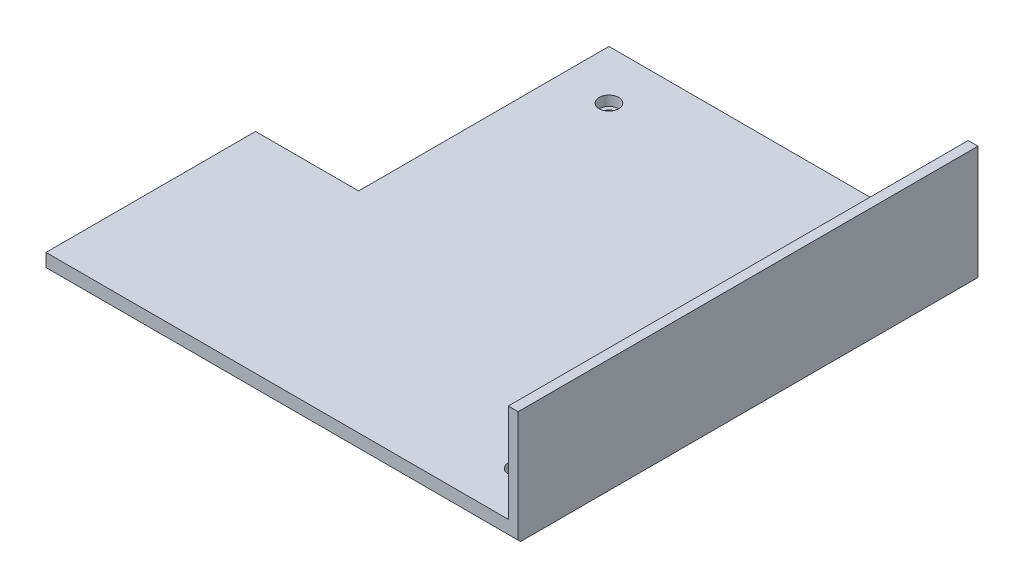
ISO-10303-21;
HEADER;
FILE_DESCRIPTION(('STEP AP214'),'2;1');
FILE_NAME('part.step','',(''),(''),'','','');
FILE_SCHEMA(('AUTOMOTIVE_DESIGN { 1 0 10303 214 1 1 1 1 }'));
ENDSEC;
DATA;
#1=APPLICATION_CONTEXT('core data for automotive mechanical design processes');
#2=APPLICATION_PROTOCOL_DEFINITION('international standard','automotive_design',2000,#1);
#3=PRODUCT_CONTEXT('',#1,'mechanical');
#4=PRODUCT('Part','Part','',(#3));
#5=PRODUCT_RELATED_PRODUCT_CATEGORY('part','',(#4));
#6=PRODUCT_DEFINITION_FORMATION('','',#4);
#7=PRODUCT_DEFINITION_CONTEXT('part definition',#1,'design');
#8=PRODUCT_DEFINITION('design','',#6,#7);
#9=PRODUCT_DEFINITION_SHAPE('','',#8);
#10=(LENGTH_UNIT() NAMED_UNIT(*) SI_UNIT(.MILLI.,.METRE.));
#11=(NAMED_UNIT(*) PLANE_ANGLE_UNIT() SI_UNIT($,.RADIAN.));
#12=(NAMED_UNIT(*) SI_UNIT($,.STERADIAN.) SOLID_ANGLE_UNIT());
#13=UNCERTAINTY_MEASURE_WITH_UNIT(LENGTH_MEASURE(1.E-05),#10,'distance_accuracy_value','');
#14=(GEOMETRIC_REPRESENTATION_CONTEXT(3) GLOBAL_UNCERTAINTY_ASSIGNED_CONTEXT((#13)) GLOBAL_UNIT_ASSIGNED_CONTEXT((#10,
#11,#12)) REPRESENTATION_CONTEXT('',''));
#15=CARTESIAN_POINT('',(0.,0.,0.));
#16=DIRECTION('',(0.,0.,1.));
#17=DIRECTION('',(1.,0.,0.));
#18=AXIS2_PLACEMENT_3D('',#15,#16,#17);
#19=CARTESIAN_POINT('',(96.2,6.35,-93.7));
#20=DIRECTION('',(1.,0.,0.));
#21=DIRECTION('',(0.,0.,1.));
#22=AXIS2_PLACEMENT_3D('',#19,#20,#21);
#23=PLANE('',#22);
#24=DIRECTION('',(0.,1.,0.));
#25=VECTOR('',#24,1.);
#26=CARTESIAN_POINT('',(96.2,-0.00100000000000013,8.3));
#27=LINE('',#26,#25);
#28=CARTESIAN_POINT('',(96.2,1.,8.3));
#29=VERTEX_POINT('',#28);
#30=CARTESIAN_POINT('',(96.2,6.35,8.3));
#31=VERTEX_POINT('',#30);
#32=EDGE_CURVE('E223',#29,#31,#27,.T.);
#33=ORIENTED_EDGE('',*,*,#32,.F.);
#34=DIRECTION('',(0.,0.,1.));
#35=VECTOR('',#34,1.);
#36=CARTESIAN_POINT('',(96.2,1.,-93.7));
#37=LINE('',#36,#35);
#38=CARTESIAN_POINT('',(96.2,1.,93.7));
#39=VERTEX_POINT('',#38);
#40=EDGE_CURVE('E11',#29,#39,#37,.T.);
#41=ORIENTED_EDGE('',*,*,#40,.T.);
#42=DIRECTION('',(0.,-1.,0.));
#43=VECTOR('',#42,1.);
#44=CARTESIAN_POINT('',(96.2,6.35,93.7));
#45=LINE('',#44,#43);
#46=CARTESIAN_POINT('',(96.2,6.35,93.7));
#47=VERTEX_POINT('',#46);
#48=EDGE_CURVE('E159',#47,#39,#45,.T.);
#49=ORIENTED_EDGE('',*,*,#48,.F.);
#50=DIRECTION('',(0.,0.,-1.));
#51=VECTOR('',#50,1.);
#52=CARTESIAN_POINT('',(96.2,6.35,-93.7));
#53=LINE('',#52,#51);
#54=EDGE_CURVE('E155',#47,#31,#53,.T.);
#55=ORIENTED_EDGE('',*,*,#54,.T.);
#56=EDGE_LOOP('',(#33,#41,#49,#55));
#57=FACE_BOUND('',#56,.T.);
#58=ADVANCED_FACE('F47',(#57),#23,.F.);
#59=CARTESIAN_POINT('',(288.6,6.35,-93.7000000000001));
#60=DIRECTION('',(0.,0.,1.));
#61=DIRECTION('',(-1.,0.,0.));
#62=AXIS2_PLACEMENT_3D('',#59,#60,#61);
#63=PLANE('',#62);
#64=DIRECTION('',(1.,0.,0.));
#65=VECTOR('',#64,1.);
#66=CARTESIAN_POINT('',(288.6,6.35,-93.7000000000001));
#67=LINE('',#66,#65);
#68=CARTESIAN_POINT('',(138.2,6.35,-93.7));
#69=VERTEX_POINT('',#68);
#70=CARTESIAN_POINT('',(284.6,6.35,-93.7000000000001));
#71=VERTEX_POINT('',#70);
#72=EDGE_CURVE('E143',#69,#71,#67,.T.);
#73=ORIENTED_EDGE('',*,*,#72,.T.);
#74=DIRECTION('',(0.,-1.,0.));
#75=VECTOR('',#74,1.);
#76=CARTESIAN_POINT('',(284.6,46.35,-93.7000000000001));
#77=LINE('',#76,#75);
#78=CARTESIAN_POINT('',(284.6,46.35,-93.7000000000001));
#79=VERTEX_POINT('',#78);
#80=EDGE_CURVE('E242',#79,#71,#77,.T.);
#81=ORIENTED_EDGE('',*,*,#80,.F.);
#82=DIRECTION('',(1.,0.,0.));
#83=VECTOR('',#82,1.);
#84=CARTESIAN_POINT('',(284.6,46.35,-93.7000000000001));
#85=LINE('',#84,#83);
#86=CARTESIAN_POINT('',(288.6,46.35,-93.7000000000001));
#87=VERTEX_POINT('',#86);
#88=EDGE_CURVE('E228',#79,#87,#85,.T.);
#89=ORIENTED_EDGE('',*,*,#88,.T.);
#90=DIRECTION('',(0.,-1.,0.));
#91=VECTOR('',#90,1.);
#92=CARTESIAN_POINT('',(288.6,6.35,-93.7000000000001));
#93=LINE('',#92,#91);
#94=CARTESIAN_POINT('',(288.6,0.,-93.7000000000001));
#95=VERTEX_POINT('',#94);
#96=EDGE_CURVE('E178',#87,#95,#93,.T.);
#97=ORIENTED_EDGE('',*,*,#96,.T.);
#98=DIRECTION('',(1.,0.,0.));
#99=VECTOR('',#98,1.);
#100=CARTESIAN_POINT('',(288.6,0.,-93.7000000000001));
#101=LINE('',#100,#99);
#102=CARTESIAN_POINT('',(138.2,0.,-93.7));
#103=VERTEX_POINT('',#102);
#104=EDGE_CURVE('E146',#103,#95,#101,.T.);
#105=ORIENTED_EDGE('',*,*,#104,.F.);
#106=DIRECTION('',(0.,1.,0.));
#107=VECTOR('',#106,1.);
#108=CARTESIAN_POINT('',(138.2,-0.00100000000000013,-93.7));
#109=LINE('',#108,#107);
#110=EDGE_CURVE('E127',#103,#69,#109,.T.);
#111=ORIENTED_EDGE('',*,*,#110,.T.);
#112=EDGE_LOOP('',(#73,#81,#89,#97,#105,#111));
#113=FACE_BOUND('',#112,.T.);
#114=ADVANCED_FACE('F141',(#113),#63,.F.);
#115=CARTESIAN_POINT('',(288.6,6.35,-93.7000000000001));
#116=DIRECTION('',(-1.,0.,0.));
#117=DIRECTION('',(0.,0.,-1.));
#118=AXIS2_PLACEMENT_3D('',#115,#116,#117);
#119=PLANE('',#118);
#120=DIRECTION('',(0.,-1.,0.));
#121=VECTOR('',#120,1.);
#122=CARTESIAN_POINT('',(288.6,6.35,93.6999999999999));
#123=LINE('',#122,#121);
#124=CARTESIAN_POINT('',(288.6,46.35,93.6999999999999));
#125=VERTEX_POINT('',#124);
#126=CARTESIAN_POINT('',(288.6,1.,93.6999999999999));
#127=VERTEX_POINT('',#126);
#128=EDGE_CURVE('E174',#125,#127,#123,.T.);
#129=ORIENTED_EDGE('',*,*,#128,.T.);
#130=DIRECTION('',(0.,0.707106781186547,0.707106781186548));
#131=VECTOR('',#130,1.);
#132=CARTESIAN_POINT('',(288.6,0.,92.6999999999999));
#133=LINE('',#132,#131);
#134=CARTESIAN_POINT('',(288.6,0.,92.6999999999999));
#135=VERTEX_POINT('',#134);
#136=EDGE_CURVE('E191',#127,#135,#133,.F.);
#137=ORIENTED_EDGE('',*,*,#136,.T.);
#138=DIRECTION('',(0.,0.,1.));
#139=VECTOR('',#138,1.);
#140=CARTESIAN_POINT('',(288.6,0.,-93.7000000000001));
#141=LINE('',#140,#139);
#142=EDGE_CURVE('E162',#95,#135,#141,.T.);
#143=ORIENTED_EDGE('',*,*,#142,.F.);
#144=ORIENTED_EDGE('',*,*,#96,.F.);
#145=DIRECTION('',(0.,0.,1.));
#146=VECTOR('',#145,1.);
#147=CARTESIAN_POINT('',(288.6,46.35,-93.7000000000001));
#148=LINE('',#147,#146);
#149=EDGE_CURVE('E232',#87,#125,#148,.T.);
#150=ORIENTED_EDGE('',*,*,#149,.T.);
#151=EDGE_LOOP('',(#129,#137,#143,#144,#150));
#152=FACE_BOUND('',#151,.T.);
#153=ADVANCED_FACE('F197',(#152),#119,.F.);
#154=CARTESIAN_POINT('',(288.6,6.35,93.6999999999999));
#155=DIRECTION('',(0.,0.,-1.));
#156=DIRECTION('',(1.,0.,0.));
#157=AXIS2_PLACEMENT_3D('',#154,#155,#156);
#158=PLANE('',#157);
#159=ORIENTED_EDGE('',*,*,#48,.T.);
#160=DIRECTION('',(1.,0.,0.));
#161=VECTOR('',#160,1.);
#162=CARTESIAN_POINT('',(288.6,1.,93.6999999999999));
#163=LINE('',#162,#161);
#164=EDGE_CURVE('E188',#39,#127,#163,.T.);
#165=ORIENTED_EDGE('',*,*,#164,.T.);
#166=ORIENTED_EDGE('',*,*,#128,.F.);
#167=DIRECTION('',(-1.,0.,0.));
#168=VECTOR('',#167,1.);
#169=CARTESIAN_POINT('',(284.6,46.35,93.6999999999999));
#170=LINE('',#169,#168);
#171=CARTESIAN_POINT('',(284.6,46.35,93.6999999999999));
#172=VERTEX_POINT('',#171);
#173=EDGE_CURVE('E235',#125,#172,#170,.T.);
#174=ORIENTED_EDGE('',*,*,#173,.T.);
#175=DIRECTION('',(0.,-1.,0.));
#176=VECTOR('',#175,1.);
#177=CARTESIAN_POINT('',(284.6,46.35,93.6999999999999));
#178=LINE('',#177,#176);
#179=CARTESIAN_POINT('',(284.6,6.35,93.6999999999999));
#180=VERTEX_POINT('',#179);
#181=EDGE_CURVE('E168',#172,#180,#178,.T.);
#182=ORIENTED_EDGE('',*,*,#181,.T.);
#183=DIRECTION('',(-1.,0.,0.));
#184=VECTOR('',#183,1.);
#185=CARTESIAN_POINT('',(288.6,6.35,93.6999999999999));
#186=LINE('',#185,#184);
#187=EDGE_CURVE('E154',#180,#47,#186,.T.);
#188=ORIENTED_EDGE('',*,*,#187,.T.);
#189=EDGE_LOOP('',(#159,#165,#166,#174,#182,#188));
#190=FACE_BOUND('',#189,.T.);
#191=ADVANCED_FACE('F250',(#190),#158,.F.);
#192=CARTESIAN_POINT('',(192.4,6.35,0.));
#193=DIRECTION('',(0.,1.,0.));
#194=DIRECTION('',(0.,0.,1.));
#195=AXIS2_PLACEMENT_3D('',#192,#193,#194);
#196=PLANE('',#195);
#197=CARTESIAN_POINT('',(268.6,6.35,-73.7000000000001));
#198=DIRECTION('',(0.,-1.,0.));
#199=DIRECTION('',(0.,0.,1.));
#200=AXIS2_PLACEMENT_3D('',#197,#198,#199);
#201=CIRCLE('',#200,3.99999999999999);
#202=CARTESIAN_POINT('',(268.6,6.35,-69.7000000000001));
#203=VERTEX_POINT('',#202);
#204=EDGE_CURVE('E211',#203,#203,#201,.T.);
#205=ORIENTED_EDGE('',*,*,#204,.T.);
#206=EDGE_LOOP('',(#205));
#207=FACE_BOUND('',#206,.T.);
#208=CARTESIAN_POINT('',(268.6,6.35,73.6999999999999));
#209=DIRECTION('',(0.,-1.,0.));
#210=DIRECTION('',(0.,0.,1.));
#211=AXIS2_PLACEMENT_3D('',#208,#209,#210);
#212=CIRCLE('',#211,3.99999999999999);
#213=CARTESIAN_POINT('',(268.6,6.35,77.6999999999999));
#214=VERTEX_POINT('',#213);
#215=EDGE_CURVE('E469',#214,#214,#212,.T.);
#216=ORIENTED_EDGE('',*,*,#215,.T.);
#217=EDGE_LOOP('',(#216));
#218=FACE_BOUND('',#217,.T.);
#219=CARTESIAN_POINT('',(158.2,6.35,-73.7));
#220=DIRECTION('',(0.,-1.,0.));
#221=DIRECTION('',(0.,0.,1.));
#222=AXIS2_PLACEMENT_3D('',#219,#220,#221);
#223=CIRCLE('',#222,3.99999999999999);
#224=CARTESIAN_POINT('',(158.2,6.35,-69.7));
#225=VERTEX_POINT('',#224);
#226=EDGE_CURVE('E472',#225,#225,#223,.T.);
#227=ORIENTED_EDGE('',*,*,#226,.T.);
#228=EDGE_LOOP('',(#227));
#229=FACE_BOUND('',#228,.T.);
#230=DIRECTION('',(-1.,0.,0.));
#231=VECTOR('',#230,1.);
#232=CARTESIAN_POINT('',(96.2,6.35,8.3));
#233=LINE('',#232,#231);
#234=CARTESIAN_POINT('',(138.2,6.35,8.29999999999999));
#235=VERTEX_POINT('',#234);
#236=EDGE_CURVE('E136',#235,#31,#233,.T.);
#237=ORIENTED_EDGE('',*,*,#236,.T.);
#238=ORIENTED_EDGE('',*,*,#54,.F.);
#239=ORIENTED_EDGE('',*,*,#187,.F.);
#240=DIRECTION('',(0.,0.,-1.));
#241=VECTOR('',#240,1.);
#242=CARTESIAN_POINT('',(284.6,6.35,-89.7000000000001));
#243=LINE('',#242,#241);
#244=EDGE_CURVE('E151',#180,#71,#243,.T.);
#245=ORIENTED_EDGE('',*,*,#244,.T.);
#246=ORIENTED_EDGE('',*,*,#72,.F.);
#247=DIRECTION('',(0.,0.,1.));
#248=VECTOR('',#247,1.);
#249=CARTESIAN_POINT('',(138.2,6.35,-93.7));
#250=LINE('',#249,#248);
#251=EDGE_CURVE('E123',#69,#235,#250,.T.);
#252=ORIENTED_EDGE('',*,*,#251,.T.);
#253=EDGE_LOOP('',(#237,#238,#239,#245,#246,#252));
#254=FACE_BOUND('',#253,.T.);
#255=ADVANCED_FACE('F149',(#207,#218,#229,#254),#196,.T.);
#256=CARTESIAN_POINT('',(192.4,0.,0.));
#257=DIRECTION('',(0.,1.,0.));
#258=DIRECTION('',(0.,0.,1.));
#259=AXIS2_PLACEMENT_3D('',#256,#257,#258);
#260=PLANE('',#259);
#261=CARTESIAN_POINT('',(268.6,0.,-73.7000000000001));
#262=DIRECTION('',(0.,-1.,0.));
#263=DIRECTION('',(0.,0.,1.));
#264=AXIS2_PLACEMENT_3D('',#261,#262,#263);
#265=CIRCLE('',#264,2.25000000000001);
#266=CARTESIAN_POINT('',(268.6,0.,-71.45));
#267=VERTEX_POINT('',#266);
#268=EDGE_CURVE('E507',#267,#267,#265,.T.);
#269=ORIENTED_EDGE('',*,*,#268,.F.);
#270=EDGE_LOOP('',(#269));
#271=FACE_BOUND('',#270,.T.);
#272=CARTESIAN_POINT('',(268.6,0.,73.6999999999999));
#273=DIRECTION('',(0.,-1.,0.));
#274=DIRECTION('',(0.,0.,1.));
#275=AXIS2_PLACEMENT_3D('',#272,#273,#274);
#276=CIRCLE('',#275,2.25000000000001);
#277=CARTESIAN_POINT('',(268.6,0.,75.9499999999999));
#278=VERTEX_POINT('',#277);
#279=EDGE_CURVE('E476',#278,#278,#276,.T.);
#280=ORIENTED_EDGE('',*,*,#279,.F.);
#281=EDGE_LOOP('',(#280));
#282=FACE_BOUND('',#281,.T.);
#283=CARTESIAN_POINT('',(158.2,0.,-73.7));
#284=DIRECTION('',(0.,-1.,0.));
#285=DIRECTION('',(0.,0.,1.));
#286=AXIS2_PLACEMENT_3D('',#283,#284,#285);
#287=CIRCLE('',#286,2.25000000000001);
#288=CARTESIAN_POINT('',(158.2,0.,-71.45));
#289=VERTEX_POINT('',#288);
#290=EDGE_CURVE('E217',#289,#289,#287,.T.);
#291=ORIENTED_EDGE('',*,*,#290,.F.);
#292=EDGE_LOOP('',(#291));
#293=FACE_BOUND('',#292,.T.);
#294=ORIENTED_EDGE('',*,*,#142,.T.);
#295=DIRECTION('',(-1.,0.,0.));
#296=VECTOR('',#295,1.);
#297=CARTESIAN_POINT('',(192.4,0.,92.7));
#298=LINE('',#297,#296);
#299=CARTESIAN_POINT('',(97.2,0.,92.7));
#300=VERTEX_POINT('',#299);
#301=EDGE_CURVE('E184',#135,#300,#298,.T.);
#302=ORIENTED_EDGE('',*,*,#301,.T.);
#303=DIRECTION('',(0.,0.,-1.));
#304=VECTOR('',#303,1.);
#305=CARTESIAN_POINT('',(97.2,0.,0.));
#306=LINE('',#305,#304);
#307=CARTESIAN_POINT('',(97.2,0.,8.3));
#308=VERTEX_POINT('',#307);
#309=EDGE_CURVE('E181',#300,#308,#306,.T.);
#310=ORIENTED_EDGE('',*,*,#309,.T.);
#311=DIRECTION('',(1.,0.,0.));
#312=VECTOR('',#311,1.);
#313=CARTESIAN_POINT('',(96.2,0.,8.3));
#314=LINE('',#313,#312);
#315=CARTESIAN_POINT('',(138.2,0.,8.29999999999999));
#316=VERTEX_POINT('',#315);
#317=EDGE_CURVE('E137',#308,#316,#314,.T.);
#318=ORIENTED_EDGE('',*,*,#317,.T.);
#319=DIRECTION('',(0.,0.,-1.));
#320=VECTOR('',#319,1.);
#321=CARTESIAN_POINT('',(138.2,0.,-93.7));
#322=LINE('',#321,#320);
#323=EDGE_CURVE('E214',#316,#103,#322,.T.);
#324=ORIENTED_EDGE('',*,*,#323,.T.);
#325=ORIENTED_EDGE('',*,*,#104,.T.);
#326=EDGE_LOOP('',(#294,#302,#310,#318,#324,#325));
#327=FACE_BOUND('',#326,.T.);
#328=ADVANCED_FACE('F205',(#271,#282,#293,#327),#260,.F.);
#329=CARTESIAN_POINT('',(284.6,46.35,-89.7000000000001));
#330=DIRECTION('',(1.,0.,0.));
#331=DIRECTION('',(0.,0.,1.));
#332=AXIS2_PLACEMENT_3D('',#329,#330,#331);
#333=PLANE('',#332);
#334=ORIENTED_EDGE('',*,*,#244,.F.);
#335=ORIENTED_EDGE('',*,*,#181,.F.);
#336=DIRECTION('',(0.,0.,-1.));
#337=VECTOR('',#336,1.);
#338=CARTESIAN_POINT('',(284.6,46.35,89.6999999999999));
#339=LINE('',#338,#337);
#340=EDGE_CURVE('E239',#172,#79,#339,.T.);
#341=ORIENTED_EDGE('',*,*,#340,.T.);
#342=ORIENTED_EDGE('',*,*,#80,.T.);
#343=EDGE_LOOP('',(#334,#335,#341,#342));
#344=FACE_BOUND('',#343,.T.);
#345=ADVANCED_FACE('F253',(#344),#333,.F.);
#346=CARTESIAN_POINT('',(192.4,46.35,0.));
#347=DIRECTION('',(0.,1.,0.));
#348=DIRECTION('',(0.,0.,1.));
#349=AXIS2_PLACEMENT_3D('',#346,#347,#348);
#350=PLANE('',#349);
#351=ORIENTED_EDGE('',*,*,#88,.F.);
#352=ORIENTED_EDGE('',*,*,#340,.F.);
#353=ORIENTED_EDGE('',*,*,#173,.F.);
#354=ORIENTED_EDGE('',*,*,#149,.F.);
#355=EDGE_LOOP('',(#351,#352,#353,#354));
#356=FACE_BOUND('',#355,.T.);
#357=ADVANCED_FACE('F256',(#356),#350,.T.);
#358=CARTESIAN_POINT('',(96.2,-0.00100000000000013,8.3));
#359=DIRECTION('',(0.,0.,1.));
#360=DIRECTION('',(-1.,0.,0.));
#361=AXIS2_PLACEMENT_3D('',#358,#359,#360);
#362=PLANE('',#361);
#363=ORIENTED_EDGE('',*,*,#317,.F.);
#364=DIRECTION('',(0.707106781186545,-0.70710678118655,0.));
#365=VECTOR('',#364,1.);
#366=CARTESIAN_POINT('',(97.2,0.,8.3));
#367=LINE('',#366,#365);
#368=EDGE_CURVE('E58',#308,#29,#367,.F.);
#369=ORIENTED_EDGE('',*,*,#368,.T.);
#370=ORIENTED_EDGE('',*,*,#32,.T.);
#371=ORIENTED_EDGE('',*,*,#236,.F.);
#372=DIRECTION('',(0.,1.,0.));
#373=VECTOR('',#372,1.);
#374=CARTESIAN_POINT('',(138.2,-0.00100000000000013,8.29999999999999));
#375=LINE('',#374,#373);
#376=EDGE_CURVE('E130',#316,#235,#375,.T.);
#377=ORIENTED_EDGE('',*,*,#376,.F.);
#378=EDGE_LOOP('',(#363,#369,#370,#371,#377));
#379=FACE_BOUND('',#378,.T.);
#380=ADVANCED_FACE('F212',(#379),#362,.F.);
#381=CARTESIAN_POINT('',(138.2,-0.00100000000000013,-93.7));
#382=DIRECTION('',(1.,0.,0.));
#383=DIRECTION('',(0.,0.,1.));
#384=AXIS2_PLACEMENT_3D('',#381,#382,#383);
#385=PLANE('',#384);
#386=ORIENTED_EDGE('',*,*,#323,.F.);
#387=ORIENTED_EDGE('',*,*,#376,.T.);
#388=ORIENTED_EDGE('',*,*,#251,.F.);
#389=ORIENTED_EDGE('',*,*,#110,.F.);
#390=EDGE_LOOP('',(#386,#387,#388,#389));
#391=FACE_BOUND('',#390,.T.);
#392=ADVANCED_FACE('F126',(#391),#385,.F.);
#393=CARTESIAN_POINT('',(158.2,6.35,-73.7));
#394=DIRECTION('',(0.,1.,0.));
#395=DIRECTION('',(0.,0.,1.));
#396=AXIS2_PLACEMENT_3D('',#393,#394,#395);
#397=CYLINDRICAL_SURFACE('',#396,2.25000000000001);
#398=ORIENTED_EDGE('',*,*,#290,.T.);
#399=EDGE_LOOP('',(#398));
#400=FACE_BOUND('',#399,.T.);
#401=CARTESIAN_POINT('',(158.2,2.35,-73.7));
#402=DIRECTION('',(0.,-1.,0.));
#403=DIRECTION('',(0.,0.,1.));
#404=AXIS2_PLACEMENT_3D('',#401,#402,#403);
#405=CIRCLE('',#404,2.25000000000002);
#406=CARTESIAN_POINT('',(158.2,2.35,-71.45));
#407=VERTEX_POINT('',#406);
#408=EDGE_CURVE('E481',#407,#407,#405,.T.);
#409=ORIENTED_EDGE('',*,*,#408,.F.);
#410=EDGE_LOOP('',(#409));
#411=FACE_BOUND('',#410,.T.);
#412=ADVANCED_FACE('F320',(#400,#411),#397,.F.);
#413=CARTESIAN_POINT('',(155.95,2.35,-73.7));
#414=DIRECTION('',(0.,-1.,0.));
#415=DIRECTION('',(0.,0.,-1.));
#416=AXIS2_PLACEMENT_3D('',#413,#414,#415);
#417=PLANE('',#416);
#418=ORIENTED_EDGE('',*,*,#408,.T.);
#419=EDGE_LOOP('',(#418));
#420=FACE_BOUND('',#419,.T.);
#421=CARTESIAN_POINT('',(158.2,2.35,-73.7));
#422=DIRECTION('',(0.,-1.,0.));
#423=DIRECTION('',(0.,0.,1.));
#424=AXIS2_PLACEMENT_3D('',#421,#422,#423);
#425=CIRCLE('',#424,3.99999999999999);
#426=CARTESIAN_POINT('',(158.2,2.35,-69.7));
#427=VERTEX_POINT('',#426);
#428=EDGE_CURVE('E475',#427,#427,#425,.T.);
#429=ORIENTED_EDGE('',*,*,#428,.F.);
#430=EDGE_LOOP('',(#429));
#431=FACE_BOUND('',#430,.T.);
#432=ADVANCED_FACE('F316',(#420,#431),#417,.F.);
#433=CARTESIAN_POINT('',(158.2,6.35,-73.7));
#434=DIRECTION('',(0.,1.,0.));
#435=DIRECTION('',(0.,0.,1.));
#436=AXIS2_PLACEMENT_3D('',#433,#434,#435);
#437=CYLINDRICAL_SURFACE('',#436,3.99999999999999);
#438=ORIENTED_EDGE('',*,*,#428,.T.);
#439=EDGE_LOOP('',(#438));
#440=FACE_BOUND('',#439,.T.);
#441=ORIENTED_EDGE('',*,*,#226,.F.);
#442=EDGE_LOOP('',(#441));
#443=FACE_BOUND('',#442,.T.);
#444=ADVANCED_FACE('F312',(#440,#443),#437,.F.);
#445=CARTESIAN_POINT('',(268.6,6.35,73.6999999999999));
#446=DIRECTION('',(0.,1.,0.));
#447=DIRECTION('',(0.,0.,1.));
#448=AXIS2_PLACEMENT_3D('',#445,#446,#447);
#449=CYLINDRICAL_SURFACE('',#448,2.25000000000001);
#450=ORIENTED_EDGE('',*,*,#279,.T.);
#451=EDGE_LOOP('',(#450));
#452=FACE_BOUND('',#451,.T.);
#453=CARTESIAN_POINT('',(268.6,2.35,73.6999999999999));
#454=DIRECTION('',(0.,-1.,0.));
#455=DIRECTION('',(0.,0.,1.));
#456=AXIS2_PLACEMENT_3D('',#453,#454,#455);
#457=CIRCLE('',#456,2.25000000000002);
#458=CARTESIAN_POINT('',(268.6,2.35,75.9499999999999));
#459=VERTEX_POINT('',#458);
#460=EDGE_CURVE('E484',#459,#459,#457,.T.);
#461=ORIENTED_EDGE('',*,*,#460,.F.);
#462=EDGE_LOOP('',(#461));
#463=FACE_BOUND('',#462,.T.);
#464=ADVANCED_FACE('F308',(#452,#463),#449,.F.);
#465=CARTESIAN_POINT('',(266.35,2.35,73.6999999999999));
#466=DIRECTION('',(0.,-1.,0.));
#467=DIRECTION('',(0.,0.,-1.));
#468=AXIS2_PLACEMENT_3D('',#465,#466,#467);
#469=PLANE('',#468);
#470=ORIENTED_EDGE('',*,*,#460,.T.);
#471=EDGE_LOOP('',(#470));
#472=FACE_BOUND('',#471,.T.);
#473=CARTESIAN_POINT('',(268.6,2.35,73.6999999999999));
#474=DIRECTION('',(0.,-1.,0.));
#475=DIRECTION('',(0.,0.,1.));
#476=AXIS2_PLACEMENT_3D('',#473,#474,#475);
#477=CIRCLE('',#476,3.99999999999999);
#478=CARTESIAN_POINT('',(268.6,2.35,77.6999999999999));
#479=VERTEX_POINT('',#478);
#480=EDGE_CURVE('E501',#479,#479,#477,.T.);
#481=ORIENTED_EDGE('',*,*,#480,.F.);
#482=EDGE_LOOP('',(#481));
#483=FACE_BOUND('',#482,.T.);
#484=ADVANCED_FACE('F304',(#472,#483),#469,.F.);
#485=CARTESIAN_POINT('',(268.6,6.35,73.6999999999999));
#486=DIRECTION('',(0.,1.,0.));
#487=DIRECTION('',(0.,0.,1.));
#488=AXIS2_PLACEMENT_3D('',#485,#486,#487);
#489=CYLINDRICAL_SURFACE('',#488,3.99999999999999);
#490=ORIENTED_EDGE('',*,*,#480,.T.);
#491=EDGE_LOOP('',(#490));
#492=FACE_BOUND('',#491,.T.);
#493=ORIENTED_EDGE('',*,*,#215,.F.);
#494=EDGE_LOOP('',(#493));
#495=FACE_BOUND('',#494,.T.);
#496=ADVANCED_FACE('F300',(#492,#495),#489,.F.);
#497=CARTESIAN_POINT('',(268.6,6.35,-73.7000000000001));
#498=DIRECTION('',(0.,1.,0.));
#499=DIRECTION('',(0.,0.,1.));
#500=AXIS2_PLACEMENT_3D('',#497,#498,#499);
#501=CYLINDRICAL_SURFACE('',#500,2.25000000000001);
#502=ORIENTED_EDGE('',*,*,#268,.T.);
#503=EDGE_LOOP('',(#502));
#504=FACE_BOUND('',#503,.T.);
#505=CARTESIAN_POINT('',(268.6,2.35,-73.7000000000001));
#506=DIRECTION('',(0.,-1.,0.));
#507=DIRECTION('',(0.,0.,1.));
#508=AXIS2_PLACEMENT_3D('',#505,#506,#507);
#509=CIRCLE('',#508,2.25000000000002);
#510=CARTESIAN_POINT('',(268.6,2.35,-71.45));
#511=VERTEX_POINT('',#510);
#512=EDGE_CURVE('E511',#511,#511,#509,.T.);
#513=ORIENTED_EDGE('',*,*,#512,.F.);
#514=EDGE_LOOP('',(#513));
#515=FACE_BOUND('',#514,.T.);
#516=ADVANCED_FACE('F292',(#504,#515),#501,.F.);
#517=CARTESIAN_POINT('',(266.35,2.35,-73.7000000000001));
#518=DIRECTION('',(0.,-1.,0.));
#519=DIRECTION('',(0.,0.,-1.));
#520=AXIS2_PLACEMENT_3D('',#517,#518,#519);
#521=PLANE('',#520);
#522=ORIENTED_EDGE('',*,*,#512,.T.);
#523=EDGE_LOOP('',(#522));
#524=FACE_BOUND('',#523,.T.);
#525=CARTESIAN_POINT('',(268.6,2.35,-73.7000000000001));
#526=DIRECTION('',(0.,-1.,0.));
#527=DIRECTION('',(0.,0.,1.));
#528=AXIS2_PLACEMENT_3D('',#525,#526,#527);
#529=CIRCLE('',#528,3.99999999999999);
#530=CARTESIAN_POINT('',(268.6,2.35,-69.7000000000001));
#531=VERTEX_POINT('',#530);
#532=EDGE_CURVE('E515',#531,#531,#529,.T.);
#533=ORIENTED_EDGE('',*,*,#532,.F.);
#534=EDGE_LOOP('',(#533));
#535=FACE_BOUND('',#534,.T.);
#536=ADVANCED_FACE('F286',(#524,#535),#521,.F.);
#537=CARTESIAN_POINT('',(268.6,6.35,-73.7000000000001));
#538=DIRECTION('',(0.,1.,0.));
#539=DIRECTION('',(0.,0.,1.));
#540=AXIS2_PLACEMENT_3D('',#537,#538,#539);
#541=CYLINDRICAL_SURFACE('',#540,3.99999999999999);
#542=ORIENTED_EDGE('',*,*,#532,.T.);
#543=EDGE_LOOP('',(#542));
#544=FACE_BOUND('',#543,.T.);
#545=ORIENTED_EDGE('',*,*,#204,.F.);
#546=EDGE_LOOP('',(#545));
#547=FACE_BOUND('',#546,.T.);
#548=ADVANCED_FACE('F283',(#544,#547),#541,.F.);
#549=CARTESIAN_POINT('',(97.2,0.,0.));
#550=DIRECTION('',(0.70710678118655,0.707106781186545,0.));
#551=DIRECTION('',(0.,0.,-1.));
#552=AXIS2_PLACEMENT_3D('',#549,#550,#551);
#553=PLANE('',#552);
#554=ORIENTED_EDGE('',*,*,#368,.F.);
#555=ORIENTED_EDGE('',*,*,#309,.F.);
#556=DIRECTION('',(-0.577350269189623,0.577350269189627,0.577350269189628));
#557=VECTOR('',#556,1.);
#558=CARTESIAN_POINT('',(128.1,-30.9000000000002,61.7999999999998));
#559=LINE('',#558,#557);
#560=EDGE_CURVE('E52',#39,#300,#559,.F.);
#561=ORIENTED_EDGE('',*,*,#560,.F.);
#562=ORIENTED_EDGE('',*,*,#40,.F.);
#563=EDGE_LOOP('',(#554,#555,#561,#562));
#564=FACE_BOUND('',#563,.T.);
#565=ADVANCED_FACE('F50',(#564),#553,.F.);
#566=CARTESIAN_POINT('',(192.4,0.,92.7));
#567=DIRECTION('',(0.,0.707106781186548,-0.707106781186547));
#568=DIRECTION('',(-1.,0.,0.));
#569=AXIS2_PLACEMENT_3D('',#566,#567,#568);
#570=PLANE('',#569);
#571=ORIENTED_EDGE('',*,*,#136,.F.);
#572=ORIENTED_EDGE('',*,*,#164,.F.);
#573=ORIENTED_EDGE('',*,*,#560,.T.);
#574=ORIENTED_EDGE('',*,*,#301,.F.);
#575=EDGE_LOOP('',(#571,#572,#573,#574));
#576=FACE_BOUND('',#575,.T.);
#577=ADVANCED_FACE('F206',(#576),#570,.F.);
#578=CLOSED_SHELL('',(#58,#114,#153,#191,#255,#328,#345,#357,#380,#392,#412,#432,#444,#464,#484,
#496,#516,#536,#548,#565,#577));
#579=MANIFOLD_SOLID_BREP('B2',#578);
#580=ADVANCED_BREP_SHAPE_REPRESENTATION('',(#18,#579),#14);
#581=SHAPE_DEFINITION_REPRESENTATION(#9,#580);
ENDSEC;
END-ISO-10303-21;
